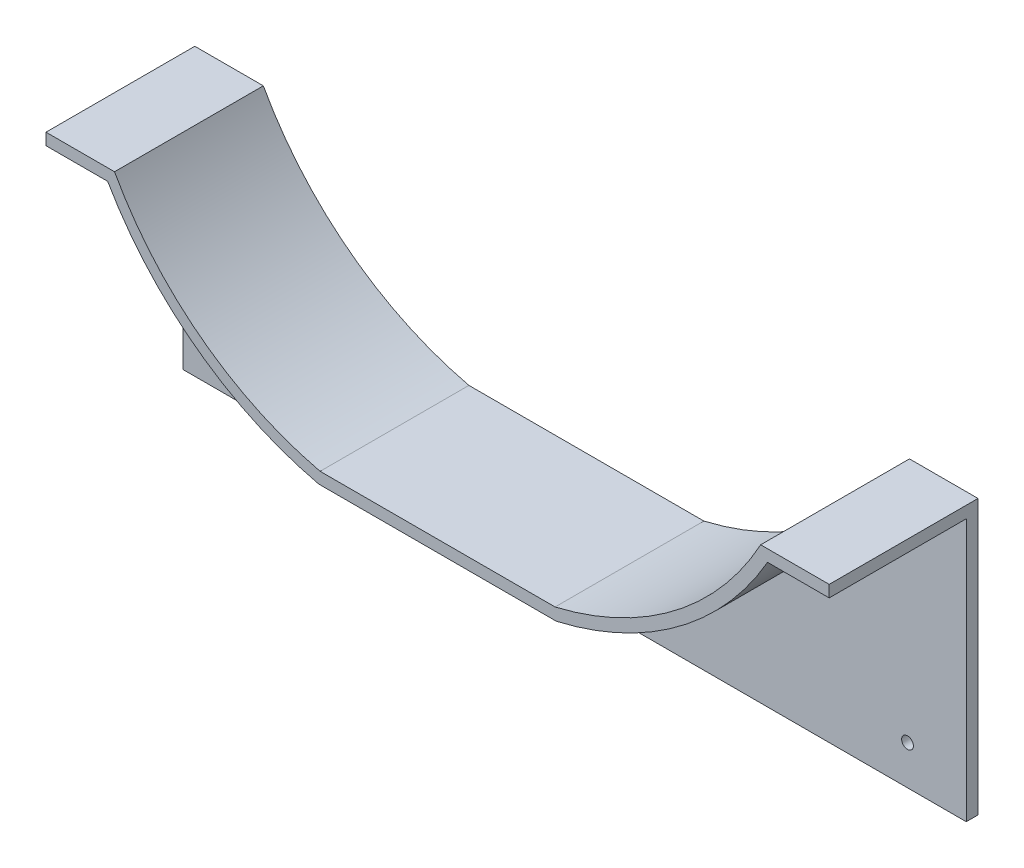
ISO-10303-21;
HEADER;
FILE_DESCRIPTION(('STEP AP214'),'2;1');
FILE_NAME('part.step','',(''),(''),'','','');
FILE_SCHEMA(('AUTOMOTIVE_DESIGN { 1 0 10303 214 1 1 1 1 }'));
ENDSEC;
DATA;
#1=APPLICATION_CONTEXT('core data for automotive mechanical design processes');
#2=APPLICATION_PROTOCOL_DEFINITION('international standard','automotive_design',2000,#1);
#3=PRODUCT_CONTEXT('',#1,'mechanical');
#4=PRODUCT('Part','Part','',(#3));
#5=PRODUCT_RELATED_PRODUCT_CATEGORY('part','',(#4));
#6=PRODUCT_DEFINITION_FORMATION('','',#4);
#7=PRODUCT_DEFINITION_CONTEXT('part definition',#1,'design');
#8=PRODUCT_DEFINITION('design','',#6,#7);
#9=PRODUCT_DEFINITION_SHAPE('','',#8);
#10=(LENGTH_UNIT() NAMED_UNIT(*) SI_UNIT(.MILLI.,.METRE.));
#11=(NAMED_UNIT(*) PLANE_ANGLE_UNIT() SI_UNIT($,.RADIAN.));
#12=(NAMED_UNIT(*) SI_UNIT($,.STERADIAN.) SOLID_ANGLE_UNIT());
#13=UNCERTAINTY_MEASURE_WITH_UNIT(LENGTH_MEASURE(1.E-05),#10,'distance_accuracy_value','');
#14=(GEOMETRIC_REPRESENTATION_CONTEXT(3) GLOBAL_UNCERTAINTY_ASSIGNED_CONTEXT((#13)) GLOBAL_UNIT_ASSIGNED_CONTEXT((#10,
#11,#12)) REPRESENTATION_CONTEXT('',''));
#15=CARTESIAN_POINT('',(0.,0.,0.));
#16=DIRECTION('',(0.,0.,1.));
#17=DIRECTION('',(1.,0.,0.));
#18=AXIS2_PLACEMENT_3D('',#15,#16,#17);
#19=CARTESIAN_POINT('',(0.,0.,3.));
#20=DIRECTION('',(0.,0.,1.));
#21=DIRECTION('',(1.,0.,0.));
#22=AXIS2_PLACEMENT_3D('',#19,#20,#21);
#23=PLANE('',#22);
#24=CARTESIAN_POINT('',(185.,-20.,3.));
#25=DIRECTION('',(0.,0.,1.));
#26=DIRECTION('',(1.,0.,0.));
#27=AXIS2_PLACEMENT_3D('',#24,#25,#26);
#28=CIRCLE('',#27,1.5);
#29=CARTESIAN_POINT('',(186.5,-20.,3.));
#30=VERTEX_POINT('',#29);
#31=EDGE_CURVE('E235',#30,#30,#28,.T.);
#32=ORIENTED_EDGE('',*,*,#31,.F.);
#33=EDGE_LOOP('',(#32));
#34=FACE_BOUND('',#33,.T.);
#35=CARTESIAN_POINT('',(100.,-20.,3.));
#36=DIRECTION('',(0.,0.,1.));
#37=DIRECTION('',(1.,0.,0.));
#38=AXIS2_PLACEMENT_3D('',#35,#36,#37);
#39=CIRCLE('',#38,1.5);
#40=CARTESIAN_POINT('',(101.5,-20.,3.));
#41=VERTEX_POINT('',#40);
#42=EDGE_CURVE('E240',#41,#41,#39,.T.);
#43=ORIENTED_EDGE('',*,*,#42,.F.);
#44=EDGE_LOOP('',(#43));
#45=FACE_BOUND('',#44,.T.);
#46=CARTESIAN_POINT('',(15.,-20.,3.));
#47=DIRECTION('',(0.,0.,1.));
#48=DIRECTION('',(-1.,0.,0.));
#49=AXIS2_PLACEMENT_3D('',#46,#47,#48);
#50=CIRCLE('',#49,1.5);
#51=CARTESIAN_POINT('',(16.5,-20.,3.));
#52=VERTEX_POINT('',#51);
#53=EDGE_CURVE('E249',#52,#52,#50,.T.);
#54=ORIENTED_EDGE('',*,*,#53,.F.);
#55=EDGE_LOOP('',(#54));
#56=FACE_BOUND('',#55,.T.);
#57=CARTESIAN_POINT('',(88.6536438802726,78.9360325928578,3.));
#58=DIRECTION('',(0.,0.,1.));
#59=DIRECTION('',(1.,0.,0.));
#60=AXIS2_PLACEMENT_3D('',#57,#58,#59);
#61=CIRCLE('',#60,84.110145305706);
#62=CARTESIAN_POINT('',(15.7435230895501,37.,3.));
#63=VERTEX_POINT('',#62);
#64=CARTESIAN_POINT('',(69.6535621359979,-3.,3.));
#65=VERTEX_POINT('',#64);
#66=EDGE_CURVE('E212',#63,#65,#61,.T.);
#67=ORIENTED_EDGE('',*,*,#66,.F.);
#68=DIRECTION('',(-1.,0.,0.));
#69=VECTOR('',#68,1.);
#70=CARTESIAN_POINT('',(0.,37.,3.));
#71=LINE('',#70,#69);
#72=CARTESIAN_POINT('',(0.,37.,3.));
#73=VERTEX_POINT('',#72);
#74=EDGE_CURVE('E149',#63,#73,#71,.T.);
#75=ORIENTED_EDGE('',*,*,#74,.T.);
#76=DIRECTION('',(0.,-1.,0.));
#77=VECTOR('',#76,1.);
#78=CARTESIAN_POINT('',(0.,0.,3.));
#79=LINE('',#78,#77);
#80=CARTESIAN_POINT('',(0.,-30.,3.));
#81=VERTEX_POINT('',#80);
#82=EDGE_CURVE('E262',#73,#81,#79,.T.);
#83=ORIENTED_EDGE('',*,*,#82,.T.);
#84=DIRECTION('',(1.,0.,0.));
#85=VECTOR('',#84,1.);
#86=CARTESIAN_POINT('',(0.,-30.,3.));
#87=LINE('',#86,#85);
#88=CARTESIAN_POINT('',(200.,-30.,3.));
#89=VERTEX_POINT('',#88);
#90=EDGE_CURVE('E266',#81,#89,#87,.T.);
#91=ORIENTED_EDGE('',*,*,#90,.T.);
#92=DIRECTION('',(0.,-1.,0.));
#93=VECTOR('',#92,1.);
#94=CARTESIAN_POINT('',(200.,0.,3.));
#95=LINE('',#94,#93);
#96=CARTESIAN_POINT('',(200.,37.,3.));
#97=VERTEX_POINT('',#96);
#98=EDGE_CURVE('E259',#97,#89,#95,.T.);
#99=ORIENTED_EDGE('',*,*,#98,.F.);
#100=DIRECTION('',(1.,0.,0.));
#101=VECTOR('',#100,1.);
#102=CARTESIAN_POINT('',(0.,37.,3.));
#103=LINE('',#102,#101);
#104=CARTESIAN_POINT('',(184.25647691045,37.,3.));
#105=VERTEX_POINT('',#104);
#106=EDGE_CURVE('E59',#105,#97,#103,.T.);
#107=ORIENTED_EDGE('',*,*,#106,.F.);
#108=CARTESIAN_POINT('',(111.346356119727,78.9360325928578,3.));
#109=DIRECTION('',(0.,0.,1.));
#110=DIRECTION('',(1.,0.,0.));
#111=AXIS2_PLACEMENT_3D('',#108,#109,#110);
#112=CIRCLE('',#111,84.110145305706);
#113=CARTESIAN_POINT('',(130.346437864002,-3.,3.));
#114=VERTEX_POINT('',#113);
#115=EDGE_CURVE('E63',#114,#105,#112,.T.);
#116=ORIENTED_EDGE('',*,*,#115,.F.);
#117=DIRECTION('',(-1.,0.,0.));
#118=VECTOR('',#117,1.);
#119=CARTESIAN_POINT('',(0.,-3.,3.));
#120=LINE('',#119,#118);
#121=EDGE_CURVE('E215',#114,#65,#120,.T.);
#122=ORIENTED_EDGE('',*,*,#121,.T.);
#123=EDGE_LOOP('',(#67,#75,#83,#91,#99,#107,#116,#122));
#124=FACE_BOUND('',#123,.T.);
#125=ADVANCED_FACE('F43',(#34,#45,#56,#124),#23,.T.);
#126=CARTESIAN_POINT('',(200.,0.,3.));
#127=DIRECTION('',(1.,0.,0.));
#128=DIRECTION('',(0.,0.,-1.));
#129=AXIS2_PLACEMENT_3D('',#126,#127,#128);
#130=PLANE('',#129);
#131=DIRECTION('',(0.,-1.,0.));
#132=VECTOR('',#131,1.);
#133=CARTESIAN_POINT('',(200.,0.,0.));
#134=LINE('',#133,#132);
#135=CARTESIAN_POINT('',(200.,40.,0.));
#136=VERTEX_POINT('',#135);
#137=CARTESIAN_POINT('',(200.,-30.,0.));
#138=VERTEX_POINT('',#137);
#139=EDGE_CURVE('E244',#136,#138,#134,.T.);
#140=ORIENTED_EDGE('',*,*,#139,.F.);
#141=DIRECTION('',(0.,0.,-1.));
#142=VECTOR('',#141,1.);
#143=CARTESIAN_POINT('',(200.,40.,3.));
#144=LINE('',#143,#142);
#145=CARTESIAN_POINT('',(200.,40.,38.));
#146=VERTEX_POINT('',#145);
#147=EDGE_CURVE('E11',#146,#136,#144,.T.);
#148=ORIENTED_EDGE('',*,*,#147,.F.);
#149=DIRECTION('',(0.,1.,0.));
#150=VECTOR('',#149,1.);
#151=CARTESIAN_POINT('',(200.,0.,38.));
#152=LINE('',#151,#150);
#153=CARTESIAN_POINT('',(200.,37.,38.));
#154=VERTEX_POINT('',#153);
#155=EDGE_CURVE('E184',#154,#146,#152,.T.);
#156=ORIENTED_EDGE('',*,*,#155,.F.);
#157=DIRECTION('',(0.,0.,-1.));
#158=VECTOR('',#157,1.);
#159=CARTESIAN_POINT('',(200.,37.,38.));
#160=LINE('',#159,#158);
#161=EDGE_CURVE('E222',#154,#97,#160,.T.);
#162=ORIENTED_EDGE('',*,*,#161,.T.);
#163=ORIENTED_EDGE('',*,*,#98,.T.);
#164=DIRECTION('',(0.,0.,-1.));
#165=VECTOR('',#164,1.);
#166=CARTESIAN_POINT('',(200.,-30.,3.));
#167=LINE('',#166,#165);
#168=EDGE_CURVE('E270',#89,#138,#167,.T.);
#169=ORIENTED_EDGE('',*,*,#168,.T.);
#170=EDGE_LOOP('',(#140,#148,#156,#162,#163,#169));
#171=FACE_BOUND('',#170,.T.);
#172=ADVANCED_FACE('F45',(#171),#130,.T.);
#173=CARTESIAN_POINT('',(0.,39.9999999999999,3.));
#174=DIRECTION('',(0.,-1.,0.));
#175=DIRECTION('',(1.,0.,0.));
#176=AXIS2_PLACEMENT_3D('',#173,#174,#175);
#177=PLANE('',#176);
#178=DIRECTION('',(-1.,0.,0.));
#179=VECTOR('',#178,1.);
#180=CARTESIAN_POINT('',(0.,39.9999999999999,0.));
#181=LINE('',#180,#179);
#182=CARTESIAN_POINT('',(182.5,40.,0.));
#183=VERTEX_POINT('',#182);
#184=EDGE_CURVE('E274',#136,#183,#181,.T.);
#185=ORIENTED_EDGE('',*,*,#184,.T.);
#186=DIRECTION('',(0.,0.,-1.));
#187=VECTOR('',#186,1.);
#188=CARTESIAN_POINT('',(182.5,40.,3.));
#189=LINE('',#188,#187);
#190=CARTESIAN_POINT('',(182.5,40.,38.));
#191=VERTEX_POINT('',#190);
#192=EDGE_CURVE('E52',#191,#183,#189,.T.);
#193=ORIENTED_EDGE('',*,*,#192,.F.);
#194=DIRECTION('',(-1.,0.,0.));
#195=VECTOR('',#194,1.);
#196=CARTESIAN_POINT('',(0.,39.9999999999999,38.));
#197=LINE('',#196,#195);
#198=EDGE_CURVE('E188',#146,#191,#197,.T.);
#199=ORIENTED_EDGE('',*,*,#198,.F.);
#200=ORIENTED_EDGE('',*,*,#147,.T.);
#201=EDGE_LOOP('',(#185,#193,#199,#200));
#202=FACE_BOUND('',#201,.T.);
#203=ADVANCED_FACE('F335',(#202),#177,.F.);
#204=CARTESIAN_POINT('',(111.346356119727,78.9360325928578,3.));
#205=DIRECTION('',(0.,0.,-1.));
#206=DIRECTION('',(-1.,0.,0.));
#207=AXIS2_PLACEMENT_3D('',#204,#205,#206);
#208=CYLINDRICAL_SURFACE('',#207,81.110145305706);
#209=CARTESIAN_POINT('',(111.346356119727,78.9360325928578,0.));
#210=DIRECTION('',(0.,0.,1.));
#211=DIRECTION('',(1.,0.,0.));
#212=AXIS2_PLACEMENT_3D('',#209,#210,#211);
#213=CIRCLE('',#212,81.110145305706);
#214=CARTESIAN_POINT('',(130.,0.,0.));
#215=VERTEX_POINT('',#214);
#216=EDGE_CURVE('E277',#183,#215,#213,.F.);
#217=ORIENTED_EDGE('',*,*,#216,.T.);
#218=DIRECTION('',(0.,0.,-1.));
#219=VECTOR('',#218,1.);
#220=CARTESIAN_POINT('',(130.,0.,3.));
#221=LINE('',#220,#219);
#222=CARTESIAN_POINT('',(130.,0.,38.));
#223=VERTEX_POINT('',#222);
#224=EDGE_CURVE('E314',#223,#215,#221,.T.);
#225=ORIENTED_EDGE('',*,*,#224,.F.);
#226=CARTESIAN_POINT('',(111.346356119727,78.9360325928578,38.));
#227=DIRECTION('',(0.,0.,1.));
#228=DIRECTION('',(1.,0.,0.));
#229=AXIS2_PLACEMENT_3D('',#226,#227,#228);
#230=CIRCLE('',#229,81.110145305706);
#231=EDGE_CURVE('E192',#191,#223,#230,.F.);
#232=ORIENTED_EDGE('',*,*,#231,.F.);
#233=ORIENTED_EDGE('',*,*,#192,.T.);
#234=EDGE_LOOP('',(#217,#225,#232,#233));
#235=FACE_BOUND('',#234,.T.);
#236=ADVANCED_FACE('F321',(#235),#208,.F.);
#237=CARTESIAN_POINT('',(0.,0.,3.));
#238=DIRECTION('',(0.,1.,0.));
#239=DIRECTION('',(0.,0.,1.));
#240=AXIS2_PLACEMENT_3D('',#237,#238,#239);
#241=PLANE('',#240);
#242=DIRECTION('',(1.,0.,0.));
#243=VECTOR('',#242,1.);
#244=CARTESIAN_POINT('',(0.,0.,0.));
#245=LINE('',#244,#243);
#246=CARTESIAN_POINT('',(70.,0.,0.));
#247=VERTEX_POINT('',#246);
#248=EDGE_CURVE('E281',#247,#215,#245,.T.);
#249=ORIENTED_EDGE('',*,*,#248,.F.);
#250=DIRECTION('',(0.,0.,-1.));
#251=VECTOR('',#250,1.);
#252=CARTESIAN_POINT('',(70.,0.,3.));
#253=LINE('',#252,#251);
#254=CARTESIAN_POINT('',(70.,0.,38.));
#255=VERTEX_POINT('',#254);
#256=EDGE_CURVE('E311',#255,#247,#253,.T.);
#257=ORIENTED_EDGE('',*,*,#256,.F.);
#258=DIRECTION('',(-1.,0.,0.));
#259=VECTOR('',#258,1.);
#260=CARTESIAN_POINT('',(0.,0.,38.));
#261=LINE('',#260,#259);
#262=EDGE_CURVE('E196',#223,#255,#261,.T.);
#263=ORIENTED_EDGE('',*,*,#262,.F.);
#264=ORIENTED_EDGE('',*,*,#224,.T.);
#265=EDGE_LOOP('',(#249,#257,#263,#264));
#266=FACE_BOUND('',#265,.T.);
#267=ADVANCED_FACE('F331',(#266),#241,.T.);
#268=CARTESIAN_POINT('',(88.6536438802726,78.9360325928578,3.));
#269=DIRECTION('',(0.,0.,-1.));
#270=DIRECTION('',(-1.,0.,0.));
#271=AXIS2_PLACEMENT_3D('',#268,#269,#270);
#272=CYLINDRICAL_SURFACE('',#271,81.110145305706);
#273=CARTESIAN_POINT('',(88.6536438802726,78.9360325928578,0.));
#274=DIRECTION('',(0.,0.,1.));
#275=DIRECTION('',(1.,0.,0.));
#276=AXIS2_PLACEMENT_3D('',#273,#274,#275);
#277=CIRCLE('',#276,81.110145305706);
#278=CARTESIAN_POINT('',(17.5,40.,0.));
#279=VERTEX_POINT('',#278);
#280=EDGE_CURVE('E285',#279,#247,#277,.T.);
#281=ORIENTED_EDGE('',*,*,#280,.F.);
#282=DIRECTION('',(0.,0.,-1.));
#283=VECTOR('',#282,1.);
#284=CARTESIAN_POINT('',(17.5,40.,3.));
#285=LINE('',#284,#283);
#286=CARTESIAN_POINT('',(17.5,40.,38.));
#287=VERTEX_POINT('',#286);
#288=EDGE_CURVE('E308',#287,#279,#285,.T.);
#289=ORIENTED_EDGE('',*,*,#288,.F.);
#290=CARTESIAN_POINT('',(88.6536438802726,78.9360325928578,38.));
#291=DIRECTION('',(0.,0.,1.));
#292=DIRECTION('',(1.,0.,0.));
#293=AXIS2_PLACEMENT_3D('',#290,#291,#292);
#294=CIRCLE('',#293,81.110145305706);
#295=EDGE_CURVE('E200',#255,#287,#294,.F.);
#296=ORIENTED_EDGE('',*,*,#295,.F.);
#297=ORIENTED_EDGE('',*,*,#256,.T.);
#298=EDGE_LOOP('',(#281,#289,#296,#297));
#299=FACE_BOUND('',#298,.T.);
#300=ADVANCED_FACE('F352',(#299),#272,.F.);
#301=CARTESIAN_POINT('',(0.,40.,3.));
#302=DIRECTION('',(0.,1.,0.));
#303=DIRECTION('',(-1.,0.,0.));
#304=AXIS2_PLACEMENT_3D('',#301,#302,#303);
#305=PLANE('',#304);
#306=DIRECTION('',(1.,0.,0.));
#307=VECTOR('',#306,1.);
#308=CARTESIAN_POINT('',(0.,40.,0.));
#309=LINE('',#308,#307);
#310=CARTESIAN_POINT('',(0.,40.,0.));
#311=VERTEX_POINT('',#310);
#312=EDGE_CURVE('E289',#311,#279,#309,.T.);
#313=ORIENTED_EDGE('',*,*,#312,.F.);
#314=DIRECTION('',(0.,0.,-1.));
#315=VECTOR('',#314,1.);
#316=CARTESIAN_POINT('',(0.,40.,3.));
#317=LINE('',#316,#315);
#318=CARTESIAN_POINT('',(0.,40.,38.));
#319=VERTEX_POINT('',#318);
#320=EDGE_CURVE('E305',#319,#311,#317,.T.);
#321=ORIENTED_EDGE('',*,*,#320,.F.);
#322=DIRECTION('',(-1.,0.,0.));
#323=VECTOR('',#322,1.);
#324=CARTESIAN_POINT('',(0.,40.,38.));
#325=LINE('',#324,#323);
#326=EDGE_CURVE('E204',#287,#319,#325,.T.);
#327=ORIENTED_EDGE('',*,*,#326,.F.);
#328=ORIENTED_EDGE('',*,*,#288,.T.);
#329=EDGE_LOOP('',(#313,#321,#327,#328));
#330=FACE_BOUND('',#329,.T.);
#331=ADVANCED_FACE('F350',(#330),#305,.T.);
#332=CARTESIAN_POINT('',(0.,0.,3.));
#333=DIRECTION('',(1.,0.,0.));
#334=DIRECTION('',(0.,1.,0.));
#335=AXIS2_PLACEMENT_3D('',#332,#333,#334);
#336=PLANE('',#335);
#337=DIRECTION('',(0.,-1.,0.));
#338=VECTOR('',#337,1.);
#339=CARTESIAN_POINT('',(0.,0.,0.));
#340=LINE('',#339,#338);
#341=CARTESIAN_POINT('',(0.,-30.,0.));
#342=VERTEX_POINT('',#341);
#343=EDGE_CURVE('E293',#311,#342,#340,.T.);
#344=ORIENTED_EDGE('',*,*,#343,.T.);
#345=DIRECTION('',(0.,0.,-1.));
#346=VECTOR('',#345,1.);
#347=CARTESIAN_POINT('',(0.,-30.,3.));
#348=LINE('',#347,#346);
#349=EDGE_CURVE('E301',#81,#342,#348,.T.);
#350=ORIENTED_EDGE('',*,*,#349,.F.);
#351=ORIENTED_EDGE('',*,*,#82,.F.);
#352=DIRECTION('',(0.,0.,-1.));
#353=VECTOR('',#352,1.);
#354=CARTESIAN_POINT('',(0.,37.,38.));
#355=LINE('',#354,#353);
#356=CARTESIAN_POINT('',(0.,37.,38.));
#357=VERTEX_POINT('',#356);
#358=EDGE_CURVE('E209',#357,#73,#355,.T.);
#359=ORIENTED_EDGE('',*,*,#358,.F.);
#360=DIRECTION('',(0.,-1.,0.));
#361=VECTOR('',#360,1.);
#362=CARTESIAN_POINT('',(0.,0.,38.));
#363=LINE('',#362,#361);
#364=EDGE_CURVE('E169',#319,#357,#363,.T.);
#365=ORIENTED_EDGE('',*,*,#364,.F.);
#366=ORIENTED_EDGE('',*,*,#320,.T.);
#367=EDGE_LOOP('',(#344,#350,#351,#359,#365,#366));
#368=FACE_BOUND('',#367,.T.);
#369=ADVANCED_FACE('F347',(#368),#336,.F.);
#370=CARTESIAN_POINT('',(0.,-30.,3.));
#371=DIRECTION('',(0.,1.,0.));
#372=DIRECTION('',(0.,0.,1.));
#373=AXIS2_PLACEMENT_3D('',#370,#371,#372);
#374=PLANE('',#373);
#375=DIRECTION('',(1.,0.,0.));
#376=VECTOR('',#375,1.);
#377=CARTESIAN_POINT('',(0.,-30.,0.));
#378=LINE('',#377,#376);
#379=EDGE_CURVE('E263',#342,#138,#378,.T.);
#380=ORIENTED_EDGE('',*,*,#379,.T.);
#381=ORIENTED_EDGE('',*,*,#168,.F.);
#382=ORIENTED_EDGE('',*,*,#90,.F.);
#383=ORIENTED_EDGE('',*,*,#349,.T.);
#384=EDGE_LOOP('',(#380,#381,#382,#383));
#385=FACE_BOUND('',#384,.T.);
#386=ADVANCED_FACE('F342',(#385),#374,.F.);
#387=CARTESIAN_POINT('',(0.,0.,0.));
#388=DIRECTION('',(0.,0.,1.));
#389=DIRECTION('',(1.,0.,0.));
#390=AXIS2_PLACEMENT_3D('',#387,#388,#389);
#391=PLANE('',#390);
#392=CARTESIAN_POINT('',(185.,-20.,0.));
#393=DIRECTION('',(0.,0.,1.));
#394=DIRECTION('',(1.,0.,0.));
#395=AXIS2_PLACEMENT_3D('',#392,#393,#394);
#396=CIRCLE('',#395,1.5);
#397=CARTESIAN_POINT('',(186.5,-20.,0.));
#398=VERTEX_POINT('',#397);
#399=EDGE_CURVE('E239',#398,#398,#396,.F.);
#400=ORIENTED_EDGE('',*,*,#399,.F.);
#401=EDGE_LOOP('',(#400));
#402=FACE_BOUND('',#401,.T.);
#403=CARTESIAN_POINT('',(100.,-20.,0.));
#404=DIRECTION('',(0.,0.,1.));
#405=DIRECTION('',(1.,0.,0.));
#406=AXIS2_PLACEMENT_3D('',#403,#404,#405);
#407=CIRCLE('',#406,1.5);
#408=CARTESIAN_POINT('',(101.5,-20.,0.));
#409=VERTEX_POINT('',#408);
#410=EDGE_CURVE('E245',#409,#409,#407,.F.);
#411=ORIENTED_EDGE('',*,*,#410,.F.);
#412=EDGE_LOOP('',(#411));
#413=FACE_BOUND('',#412,.T.);
#414=CARTESIAN_POINT('',(15.,-20.,0.));
#415=DIRECTION('',(0.,0.,1.));
#416=DIRECTION('',(1.,0.,0.));
#417=AXIS2_PLACEMENT_3D('',#414,#415,#416);
#418=CIRCLE('',#417,1.5);
#419=CARTESIAN_POINT('',(16.5,-20.,0.));
#420=VERTEX_POINT('',#419);
#421=EDGE_CURVE('E153',#420,#420,#418,.F.);
#422=ORIENTED_EDGE('',*,*,#421,.F.);
#423=EDGE_LOOP('',(#422));
#424=FACE_BOUND('',#423,.T.);
#425=ORIENTED_EDGE('',*,*,#139,.T.);
#426=ORIENTED_EDGE('',*,*,#379,.F.);
#427=ORIENTED_EDGE('',*,*,#343,.F.);
#428=ORIENTED_EDGE('',*,*,#312,.T.);
#429=ORIENTED_EDGE('',*,*,#280,.T.);
#430=ORIENTED_EDGE('',*,*,#248,.T.);
#431=ORIENTED_EDGE('',*,*,#216,.F.);
#432=ORIENTED_EDGE('',*,*,#184,.F.);
#433=EDGE_LOOP('',(#425,#426,#427,#428,#429,#430,#431,#432));
#434=FACE_BOUND('',#433,.T.);
#435=ADVANCED_FACE('F326',(#402,#413,#424,#434),#391,.F.);
#436=CARTESIAN_POINT('',(15.,-20.,-4.24264068711928));
#437=DIRECTION('',(0.,0.,1.));
#438=DIRECTION('',(1.,0.,0.));
#439=AXIS2_PLACEMENT_3D('',#436,#437,#438);
#440=CYLINDRICAL_SURFACE('',#439,1.5);
#441=CARTESIAN_POINT('',(16.5,-20.,0.));
#442=CARTESIAN_POINT('',(16.5,-20.,0.0312499999999992));
#443=CARTESIAN_POINT('',(16.5,-20.,0.0624999999999992));
#444=CARTESIAN_POINT('',(16.5,-20.,0.124999999999999));
#445=CARTESIAN_POINT('',(16.5,-20.,0.156249999999999));
#446=CARTESIAN_POINT('',(16.5,-20.,0.218749999999999));
#447=CARTESIAN_POINT('',(16.5,-20.,0.249999999999999));
#448=CARTESIAN_POINT('',(16.5,-20.,0.312499999999999));
#449=CARTESIAN_POINT('',(16.5,-20.,0.343749999999999));
#450=CARTESIAN_POINT('',(16.5,-20.,0.40625));
#451=CARTESIAN_POINT('',(16.5,-20.,0.4375));
#452=CARTESIAN_POINT('',(16.5,-20.,0.5));
#453=CARTESIAN_POINT('',(16.5,-20.,0.53125));
#454=CARTESIAN_POINT('',(16.5,-20.,0.59375));
#455=CARTESIAN_POINT('',(16.5,-20.,0.625));
#456=CARTESIAN_POINT('',(16.5,-20.,0.6875));
#457=CARTESIAN_POINT('',(16.5,-20.,0.71875));
#458=CARTESIAN_POINT('',(16.5,-20.,0.78125));
#459=CARTESIAN_POINT('',(16.5,-20.,0.8125));
#460=CARTESIAN_POINT('',(16.5,-20.,0.875));
#461=CARTESIAN_POINT('',(16.5,-20.,0.906249999999999));
#462=CARTESIAN_POINT('',(16.5,-20.,0.968749999999999));
#463=CARTESIAN_POINT('',(16.5,-20.,0.999999999999999));
#464=CARTESIAN_POINT('',(16.5,-20.,1.0625));
#465=CARTESIAN_POINT('',(16.5,-20.,1.09375));
#466=CARTESIAN_POINT('',(16.5,-20.,1.15625));
#467=CARTESIAN_POINT('',(16.5,-20.,1.1875));
#468=CARTESIAN_POINT('',(16.5,-20.,1.25));
#469=CARTESIAN_POINT('',(16.5,-20.,1.28125));
#470=CARTESIAN_POINT('',(16.5,-20.,1.34375));
#471=CARTESIAN_POINT('',(16.5,-20.,1.375));
#472=CARTESIAN_POINT('',(16.5,-20.,1.4375));
#473=CARTESIAN_POINT('',(16.5,-20.,1.46875));
#474=CARTESIAN_POINT('',(16.5,-20.,1.53125));
#475=CARTESIAN_POINT('',(16.5,-20.,1.5625));
#476=CARTESIAN_POINT('',(16.5,-20.,1.625));
#477=CARTESIAN_POINT('',(16.5,-20.,1.65625));
#478=CARTESIAN_POINT('',(16.5,-20.,1.71875));
#479=CARTESIAN_POINT('',(16.5,-20.,1.75));
#480=CARTESIAN_POINT('',(16.5,-20.,1.8125));
#481=CARTESIAN_POINT('',(16.5,-20.,1.84375));
#482=CARTESIAN_POINT('',(16.5,-20.,1.90625));
#483=CARTESIAN_POINT('',(16.5,-20.,1.9375));
#484=CARTESIAN_POINT('',(16.5,-20.,2.));
#485=CARTESIAN_POINT('',(16.5,-20.,2.03125));
#486=CARTESIAN_POINT('',(16.5,-20.,2.09375));
#487=CARTESIAN_POINT('',(16.5,-20.,2.125));
#488=CARTESIAN_POINT('',(16.5,-20.,2.1875));
#489=CARTESIAN_POINT('',(16.5,-20.,2.21875));
#490=CARTESIAN_POINT('',(16.5,-20.,2.28125));
#491=CARTESIAN_POINT('',(16.5,-20.,2.3125));
#492=CARTESIAN_POINT('',(16.5,-20.,2.375));
#493=CARTESIAN_POINT('',(16.5,-20.,2.40625));
#494=CARTESIAN_POINT('',(16.5,-20.,2.46875));
#495=CARTESIAN_POINT('',(16.5,-20.,2.5));
#496=CARTESIAN_POINT('',(16.5,-20.,2.5625));
#497=CARTESIAN_POINT('',(16.5,-20.,2.59375));
#498=CARTESIAN_POINT('',(16.5,-20.,2.65625));
#499=CARTESIAN_POINT('',(16.5,-20.,2.6875));
#500=CARTESIAN_POINT('',(16.5,-20.,2.75));
#501=CARTESIAN_POINT('',(16.5,-20.,2.78125));
#502=CARTESIAN_POINT('',(16.5,-20.,2.84375));
#503=CARTESIAN_POINT('',(16.5,-20.,2.875));
#504=CARTESIAN_POINT('',(16.5,-20.,2.9375));
#505=CARTESIAN_POINT('',(16.5,-20.,2.96875));
#506=CARTESIAN_POINT('',(16.5,-20.,3.));
#507=B_SPLINE_CURVE_WITH_KNOTS('',3,(#441,#442,#443,#444,#445,#446,#447,#448,#449,#450,#451,
#452,#453,#454,#455,#456,#457,#458,#459,#460,#461,#462,#463,#464,#465,#466,#467,#468,#469,#470,
#471,#472,#473,#474,#475,#476,#477,#478,#479,#480,#481,#482,#483,#484,#485,#486,#487,#488,#489,
#490,#491,#492,#493,#494,#495,#496,#497,#498,#499,#500,#501,#502,#503,#504,#505,#506),
.UNSPECIFIED.,.F.,.F.,(4,2,2,2,2,2,2,2,2,2,2,2,2,2,2,2,2,2,2,2,2,2,2,2,2,2,2,2,2,2,2,2,4),(0.,
0.0937500000000001,0.1875,0.28125,0.375,0.46875,0.5625,0.656250000000001,0.750000000000001,
0.843750000000001,0.9375,1.03125,1.125,1.21875,1.3125,1.40625,1.5,1.59375,1.6875,1.78125,1.875,
1.96875,2.0625,2.15625,2.25,2.34375,2.4375,2.53125,2.625,2.71875,2.8125,2.90625,3.),.UNSPECIFIED.);
#508=EDGE_CURVE('BSEAM371',#420,#52,#507,.T.);
#509=ORIENTED_EDGE('',*,*,#421,.T.);
#510=ORIENTED_EDGE('',*,*,#53,.T.);
#511=ORIENTED_EDGE('',*,*,#508,.T.);
#512=ORIENTED_EDGE('',*,*,#508,.F.);
#513=EDGE_LOOP('',(#509,#511,#510,#512));
#514=FACE_BOUND('',#513,.T.);
#515=ADVANCED_FACE('F371',(#514),#440,.F.);
#516=CARTESIAN_POINT('',(100.,-20.,-4.24264068711928));
#517=DIRECTION('',(0.,0.,1.));
#518=DIRECTION('',(1.,0.,0.));
#519=AXIS2_PLACEMENT_3D('',#516,#517,#518);
#520=CYLINDRICAL_SURFACE('',#519,1.5);
#521=CARTESIAN_POINT('',(101.5,-20.,0.));
#522=CARTESIAN_POINT('',(101.5,-20.,0.0312499999999992));
#523=CARTESIAN_POINT('',(101.5,-20.,0.0624999999999992));
#524=CARTESIAN_POINT('',(101.5,-20.,0.124999999999999));
#525=CARTESIAN_POINT('',(101.5,-20.,0.156249999999999));
#526=CARTESIAN_POINT('',(101.5,-20.,0.218749999999999));
#527=CARTESIAN_POINT('',(101.5,-20.,0.249999999999999));
#528=CARTESIAN_POINT('',(101.5,-20.,0.312499999999999));
#529=CARTESIAN_POINT('',(101.5,-20.,0.343749999999999));
#530=CARTESIAN_POINT('',(101.5,-20.,0.40625));
#531=CARTESIAN_POINT('',(101.5,-20.,0.4375));
#532=CARTESIAN_POINT('',(101.5,-20.,0.5));
#533=CARTESIAN_POINT('',(101.5,-20.,0.53125));
#534=CARTESIAN_POINT('',(101.5,-20.,0.59375));
#535=CARTESIAN_POINT('',(101.5,-20.,0.625));
#536=CARTESIAN_POINT('',(101.5,-20.,0.6875));
#537=CARTESIAN_POINT('',(101.5,-20.,0.71875));
#538=CARTESIAN_POINT('',(101.5,-20.,0.78125));
#539=CARTESIAN_POINT('',(101.5,-20.,0.8125));
#540=CARTESIAN_POINT('',(101.5,-20.,0.875));
#541=CARTESIAN_POINT('',(101.5,-20.,0.906249999999999));
#542=CARTESIAN_POINT('',(101.5,-20.,0.968749999999999));
#543=CARTESIAN_POINT('',(101.5,-20.,0.999999999999999));
#544=CARTESIAN_POINT('',(101.5,-20.,1.0625));
#545=CARTESIAN_POINT('',(101.5,-20.,1.09375));
#546=CARTESIAN_POINT('',(101.5,-20.,1.15625));
#547=CARTESIAN_POINT('',(101.5,-20.,1.1875));
#548=CARTESIAN_POINT('',(101.5,-20.,1.25));
#549=CARTESIAN_POINT('',(101.5,-20.,1.28125));
#550=CARTESIAN_POINT('',(101.5,-20.,1.34375));
#551=CARTESIAN_POINT('',(101.5,-20.,1.375));
#552=CARTESIAN_POINT('',(101.5,-20.,1.4375));
#553=CARTESIAN_POINT('',(101.5,-20.,1.46875));
#554=CARTESIAN_POINT('',(101.5,-20.,1.53125));
#555=CARTESIAN_POINT('',(101.5,-20.,1.5625));
#556=CARTESIAN_POINT('',(101.5,-20.,1.625));
#557=CARTESIAN_POINT('',(101.5,-20.,1.65625));
#558=CARTESIAN_POINT('',(101.5,-20.,1.71875));
#559=CARTESIAN_POINT('',(101.5,-20.,1.75));
#560=CARTESIAN_POINT('',(101.5,-20.,1.8125));
#561=CARTESIAN_POINT('',(101.5,-20.,1.84375));
#562=CARTESIAN_POINT('',(101.5,-20.,1.90625));
#563=CARTESIAN_POINT('',(101.5,-20.,1.9375));
#564=CARTESIAN_POINT('',(101.5,-20.,2.));
#565=CARTESIAN_POINT('',(101.5,-20.,2.03125));
#566=CARTESIAN_POINT('',(101.5,-20.,2.09375));
#567=CARTESIAN_POINT('',(101.5,-20.,2.125));
#568=CARTESIAN_POINT('',(101.5,-20.,2.1875));
#569=CARTESIAN_POINT('',(101.5,-20.,2.21875));
#570=CARTESIAN_POINT('',(101.5,-20.,2.28125));
#571=CARTESIAN_POINT('',(101.5,-20.,2.3125));
#572=CARTESIAN_POINT('',(101.5,-20.,2.375));
#573=CARTESIAN_POINT('',(101.5,-20.,2.40625));
#574=CARTESIAN_POINT('',(101.5,-20.,2.46875));
#575=CARTESIAN_POINT('',(101.5,-20.,2.5));
#576=CARTESIAN_POINT('',(101.5,-20.,2.5625));
#577=CARTESIAN_POINT('',(101.5,-20.,2.59375));
#578=CARTESIAN_POINT('',(101.5,-20.,2.65625));
#579=CARTESIAN_POINT('',(101.5,-20.,2.6875));
#580=CARTESIAN_POINT('',(101.5,-20.,2.75));
#581=CARTESIAN_POINT('',(101.5,-20.,2.78125));
#582=CARTESIAN_POINT('',(101.5,-20.,2.84375));
#583=CARTESIAN_POINT('',(101.5,-20.,2.875));
#584=CARTESIAN_POINT('',(101.5,-20.,2.9375));
#585=CARTESIAN_POINT('',(101.5,-20.,2.96875));
#586=CARTESIAN_POINT('',(101.5,-20.,3.));
#587=B_SPLINE_CURVE_WITH_KNOTS('',3,(#521,#522,#523,#524,#525,#526,#527,#528,#529,#530,#531,
#532,#533,#534,#535,#536,#537,#538,#539,#540,#541,#542,#543,#544,#545,#546,#547,#548,#549,#550,
#551,#552,#553,#554,#555,#556,#557,#558,#559,#560,#561,#562,#563,#564,#565,#566,#567,#568,#569,
#570,#571,#572,#573,#574,#575,#576,#577,#578,#579,#580,#581,#582,#583,#584,#585,#586),
.UNSPECIFIED.,.F.,.F.,(4,2,2,2,2,2,2,2,2,2,2,2,2,2,2,2,2,2,2,2,2,2,2,2,2,2,2,2,2,2,2,2,4),(0.,
0.0937500000000001,0.1875,0.28125,0.375,0.46875,0.5625,0.656250000000001,0.750000000000001,
0.843750000000001,0.9375,1.03125,1.125,1.21875,1.3125,1.40625,1.5,1.59375,1.6875,1.78125,1.875,
1.96875,2.0625,2.15625,2.25,2.34375,2.4375,2.53125,2.625,2.71875,2.8125,2.90625,3.),.UNSPECIFIED.);
#588=EDGE_CURVE('BSEAM394',#409,#41,#587,.T.);
#589=ORIENTED_EDGE('',*,*,#410,.T.);
#590=ORIENTED_EDGE('',*,*,#42,.T.);
#591=ORIENTED_EDGE('',*,*,#588,.T.);
#592=ORIENTED_EDGE('',*,*,#588,.F.);
#593=EDGE_LOOP('',(#589,#591,#590,#592));
#594=FACE_BOUND('',#593,.T.);
#595=ADVANCED_FACE('F394',(#594),#520,.F.);
#596=CARTESIAN_POINT('',(185.,-20.,-4.24264068711928));
#597=DIRECTION('',(0.,0.,1.));
#598=DIRECTION('',(1.,0.,0.));
#599=AXIS2_PLACEMENT_3D('',#596,#597,#598);
#600=CYLINDRICAL_SURFACE('',#599,1.5);
#601=CARTESIAN_POINT('',(186.5,-20.,0.));
#602=CARTESIAN_POINT('',(186.5,-20.,0.0312499999999992));
#603=CARTESIAN_POINT('',(186.5,-20.,0.0624999999999992));
#604=CARTESIAN_POINT('',(186.5,-20.,0.124999999999999));
#605=CARTESIAN_POINT('',(186.5,-20.,0.156249999999999));
#606=CARTESIAN_POINT('',(186.5,-20.,0.218749999999999));
#607=CARTESIAN_POINT('',(186.5,-20.,0.249999999999999));
#608=CARTESIAN_POINT('',(186.5,-20.,0.312499999999999));
#609=CARTESIAN_POINT('',(186.5,-20.,0.343749999999999));
#610=CARTESIAN_POINT('',(186.5,-20.,0.40625));
#611=CARTESIAN_POINT('',(186.5,-20.,0.4375));
#612=CARTESIAN_POINT('',(186.5,-20.,0.5));
#613=CARTESIAN_POINT('',(186.5,-20.,0.53125));
#614=CARTESIAN_POINT('',(186.5,-20.,0.59375));
#615=CARTESIAN_POINT('',(186.5,-20.,0.625));
#616=CARTESIAN_POINT('',(186.5,-20.,0.6875));
#617=CARTESIAN_POINT('',(186.5,-20.,0.71875));
#618=CARTESIAN_POINT('',(186.5,-20.,0.78125));
#619=CARTESIAN_POINT('',(186.5,-20.,0.8125));
#620=CARTESIAN_POINT('',(186.5,-20.,0.875));
#621=CARTESIAN_POINT('',(186.5,-20.,0.906249999999999));
#622=CARTESIAN_POINT('',(186.5,-20.,0.968749999999999));
#623=CARTESIAN_POINT('',(186.5,-20.,0.999999999999999));
#624=CARTESIAN_POINT('',(186.5,-20.,1.0625));
#625=CARTESIAN_POINT('',(186.5,-20.,1.09375));
#626=CARTESIAN_POINT('',(186.5,-20.,1.15625));
#627=CARTESIAN_POINT('',(186.5,-20.,1.1875));
#628=CARTESIAN_POINT('',(186.5,-20.,1.25));
#629=CARTESIAN_POINT('',(186.5,-20.,1.28125));
#630=CARTESIAN_POINT('',(186.5,-20.,1.34375));
#631=CARTESIAN_POINT('',(186.5,-20.,1.375));
#632=CARTESIAN_POINT('',(186.5,-20.,1.4375));
#633=CARTESIAN_POINT('',(186.5,-20.,1.46875));
#634=CARTESIAN_POINT('',(186.5,-20.,1.53125));
#635=CARTESIAN_POINT('',(186.5,-20.,1.5625));
#636=CARTESIAN_POINT('',(186.5,-20.,1.625));
#637=CARTESIAN_POINT('',(186.5,-20.,1.65625));
#638=CARTESIAN_POINT('',(186.5,-20.,1.71875));
#639=CARTESIAN_POINT('',(186.5,-20.,1.75));
#640=CARTESIAN_POINT('',(186.5,-20.,1.8125));
#641=CARTESIAN_POINT('',(186.5,-20.,1.84375));
#642=CARTESIAN_POINT('',(186.5,-20.,1.90625));
#643=CARTESIAN_POINT('',(186.5,-20.,1.9375));
#644=CARTESIAN_POINT('',(186.5,-20.,2.));
#645=CARTESIAN_POINT('',(186.5,-20.,2.03125));
#646=CARTESIAN_POINT('',(186.5,-20.,2.09375));
#647=CARTESIAN_POINT('',(186.5,-20.,2.125));
#648=CARTESIAN_POINT('',(186.5,-20.,2.1875));
#649=CARTESIAN_POINT('',(186.5,-20.,2.21875));
#650=CARTESIAN_POINT('',(186.5,-20.,2.28125));
#651=CARTESIAN_POINT('',(186.5,-20.,2.3125));
#652=CARTESIAN_POINT('',(186.5,-20.,2.375));
#653=CARTESIAN_POINT('',(186.5,-20.,2.40625));
#654=CARTESIAN_POINT('',(186.5,-20.,2.46875));
#655=CARTESIAN_POINT('',(186.5,-20.,2.5));
#656=CARTESIAN_POINT('',(186.5,-20.,2.5625));
#657=CARTESIAN_POINT('',(186.5,-20.,2.59375));
#658=CARTESIAN_POINT('',(186.5,-20.,2.65625));
#659=CARTESIAN_POINT('',(186.5,-20.,2.6875));
#660=CARTESIAN_POINT('',(186.5,-20.,2.75));
#661=CARTESIAN_POINT('',(186.5,-20.,2.78125));
#662=CARTESIAN_POINT('',(186.5,-20.,2.84375));
#663=CARTESIAN_POINT('',(186.5,-20.,2.875));
#664=CARTESIAN_POINT('',(186.5,-20.,2.9375));
#665=CARTESIAN_POINT('',(186.5,-20.,2.96875));
#666=CARTESIAN_POINT('',(186.5,-20.,3.));
#667=B_SPLINE_CURVE_WITH_KNOTS('',3,(#601,#602,#603,#604,#605,#606,#607,#608,#609,#610,#611,
#612,#613,#614,#615,#616,#617,#618,#619,#620,#621,#622,#623,#624,#625,#626,#627,#628,#629,#630,
#631,#632,#633,#634,#635,#636,#637,#638,#639,#640,#641,#642,#643,#644,#645,#646,#647,#648,#649,
#650,#651,#652,#653,#654,#655,#656,#657,#658,#659,#660,#661,#662,#663,#664,#665,#666),
.UNSPECIFIED.,.F.,.F.,(4,2,2,2,2,2,2,2,2,2,2,2,2,2,2,2,2,2,2,2,2,2,2,2,2,2,2,2,2,2,2,2,4),(0.,
0.0937500000000001,0.1875,0.28125,0.375,0.46875,0.5625,0.656250000000001,0.750000000000001,
0.843750000000001,0.9375,1.03125,1.125,1.21875,1.3125,1.40625,1.5,1.59375,1.6875,1.78125,1.875,
1.96875,2.0625,2.15625,2.25,2.34375,2.4375,2.53125,2.625,2.71875,2.8125,2.90625,3.),.UNSPECIFIED.);
#668=EDGE_CURVE('BSEAM400',#398,#30,#667,.T.);
#669=ORIENTED_EDGE('',*,*,#399,.T.);
#670=ORIENTED_EDGE('',*,*,#31,.T.);
#671=ORIENTED_EDGE('',*,*,#668,.T.);
#672=ORIENTED_EDGE('',*,*,#668,.F.);
#673=EDGE_LOOP('',(#669,#671,#670,#672));
#674=FACE_BOUND('',#673,.T.);
#675=ADVANCED_FACE('F400',(#674),#600,.F.);
#676=CARTESIAN_POINT('',(0.,37.,38.));
#677=DIRECTION('',(0.,-1.,0.));
#678=DIRECTION('',(0.,0.,-1.));
#679=AXIS2_PLACEMENT_3D('',#676,#677,#678);
#680=PLANE('',#679);
#681=ORIENTED_EDGE('',*,*,#74,.F.);
#682=DIRECTION('',(0.,0.,-1.));
#683=VECTOR('',#682,1.);
#684=CARTESIAN_POINT('',(15.7435230895501,37.,38.));
#685=LINE('',#684,#683);
#686=CARTESIAN_POINT('',(15.7435230895501,37.,38.));
#687=VERTEX_POINT('',#686);
#688=EDGE_CURVE('E143',#687,#63,#685,.T.);
#689=ORIENTED_EDGE('',*,*,#688,.F.);
#690=DIRECTION('',(-1.,0.,0.));
#691=VECTOR('',#690,1.);
#692=CARTESIAN_POINT('',(0.,37.,38.));
#693=LINE('',#692,#691);
#694=EDGE_CURVE('E148',#687,#357,#693,.T.);
#695=ORIENTED_EDGE('',*,*,#694,.T.);
#696=ORIENTED_EDGE('',*,*,#358,.T.);
#697=EDGE_LOOP('',(#681,#689,#695,#696));
#698=FACE_BOUND('',#697,.T.);
#699=ADVANCED_FACE('F145',(#698),#680,.T.);
#700=CARTESIAN_POINT('',(88.6536438802726,78.9360325928578,38.));
#701=DIRECTION('',(0.,0.,-1.));
#702=DIRECTION('',(-1.,0.,0.));
#703=AXIS2_PLACEMENT_3D('',#700,#701,#702);
#704=CYLINDRICAL_SURFACE('',#703,84.110145305706);
#705=ORIENTED_EDGE('',*,*,#66,.T.);
#706=DIRECTION('',(0.,0.,-1.));
#707=VECTOR('',#706,1.);
#708=CARTESIAN_POINT('',(69.6535621359979,-3.,38.));
#709=LINE('',#708,#707);
#710=CARTESIAN_POINT('',(69.6535621359979,-3.,38.));
#711=VERTEX_POINT('',#710);
#712=EDGE_CURVE('E154',#711,#65,#709,.T.);
#713=ORIENTED_EDGE('',*,*,#712,.F.);
#714=CARTESIAN_POINT('',(88.6536438802726,78.9360325928578,38.));
#715=DIRECTION('',(0.,0.,1.));
#716=DIRECTION('',(1.,0.,0.));
#717=AXIS2_PLACEMENT_3D('',#714,#715,#716);
#718=CIRCLE('',#717,84.110145305706);
#719=EDGE_CURVE('E157',#687,#711,#718,.T.);
#720=ORIENTED_EDGE('',*,*,#719,.F.);
#721=ORIENTED_EDGE('',*,*,#688,.T.);
#722=EDGE_LOOP('',(#705,#713,#720,#721));
#723=FACE_BOUND('',#722,.T.);
#724=ADVANCED_FACE('F158',(#723),#704,.T.);
#725=CARTESIAN_POINT('',(0.,-3.,38.));
#726=DIRECTION('',(0.,-1.,0.));
#727=DIRECTION('',(0.,0.,-1.));
#728=AXIS2_PLACEMENT_3D('',#725,#726,#727);
#729=PLANE('',#728);
#730=ORIENTED_EDGE('',*,*,#121,.F.);
#731=DIRECTION('',(0.,0.,-1.));
#732=VECTOR('',#731,1.);
#733=CARTESIAN_POINT('',(130.346437864002,-3.,38.));
#734=LINE('',#733,#732);
#735=CARTESIAN_POINT('',(130.346437864002,-3.,38.));
#736=VERTEX_POINT('',#735);
#737=EDGE_CURVE('E230',#736,#114,#734,.T.);
#738=ORIENTED_EDGE('',*,*,#737,.F.);
#739=DIRECTION('',(-1.,0.,0.));
#740=VECTOR('',#739,1.);
#741=CARTESIAN_POINT('',(0.,-3.,38.));
#742=LINE('',#741,#740);
#743=EDGE_CURVE('E164',#736,#711,#742,.T.);
#744=ORIENTED_EDGE('',*,*,#743,.T.);
#745=ORIENTED_EDGE('',*,*,#712,.T.);
#746=EDGE_LOOP('',(#730,#738,#744,#745));
#747=FACE_BOUND('',#746,.T.);
#748=ADVANCED_FACE('F417',(#747),#729,.T.);
#749=CARTESIAN_POINT('',(111.346356119727,78.9360325928578,38.));
#750=DIRECTION('',(0.,0.,-1.));
#751=DIRECTION('',(-1.,0.,0.));
#752=AXIS2_PLACEMENT_3D('',#749,#750,#751);
#753=CYLINDRICAL_SURFACE('',#752,84.110145305706);
#754=ORIENTED_EDGE('',*,*,#115,.T.);
#755=DIRECTION('',(0.,0.,-1.));
#756=VECTOR('',#755,1.);
#757=CARTESIAN_POINT('',(184.25647691045,37.,38.));
#758=LINE('',#757,#756);
#759=CARTESIAN_POINT('',(184.25647691045,37.,38.));
#760=VERTEX_POINT('',#759);
#761=EDGE_CURVE('E226',#760,#105,#758,.T.);
#762=ORIENTED_EDGE('',*,*,#761,.F.);
#763=CARTESIAN_POINT('',(111.346356119727,78.9360325928578,38.));
#764=DIRECTION('',(0.,0.,1.));
#765=DIRECTION('',(1.,0.,0.));
#766=AXIS2_PLACEMENT_3D('',#763,#764,#765);
#767=CIRCLE('',#766,84.110145305706);
#768=EDGE_CURVE('E179',#736,#760,#767,.T.);
#769=ORIENTED_EDGE('',*,*,#768,.F.);
#770=ORIENTED_EDGE('',*,*,#737,.T.);
#771=EDGE_LOOP('',(#754,#762,#769,#770));
#772=FACE_BOUND('',#771,.T.);
#773=ADVANCED_FACE('F423',(#772),#753,.T.);
#774=CARTESIAN_POINT('',(0.,37.,38.));
#775=DIRECTION('',(0.,1.,0.));
#776=DIRECTION('',(0.,0.,1.));
#777=AXIS2_PLACEMENT_3D('',#774,#775,#776);
#778=PLANE('',#777);
#779=ORIENTED_EDGE('',*,*,#106,.T.);
#780=ORIENTED_EDGE('',*,*,#161,.F.);
#781=DIRECTION('',(1.,0.,0.));
#782=VECTOR('',#781,1.);
#783=CARTESIAN_POINT('',(0.,37.,38.));
#784=LINE('',#783,#782);
#785=EDGE_CURVE('E182',#760,#154,#784,.T.);
#786=ORIENTED_EDGE('',*,*,#785,.F.);
#787=ORIENTED_EDGE('',*,*,#761,.T.);
#788=EDGE_LOOP('',(#779,#780,#786,#787));
#789=FACE_BOUND('',#788,.T.);
#790=ADVANCED_FACE('F430',(#789),#778,.F.);
#791=CARTESIAN_POINT('',(0.,0.,38.));
#792=DIRECTION('',(0.,0.,1.));
#793=DIRECTION('',(1.,0.,0.));
#794=AXIS2_PLACEMENT_3D('',#791,#792,#793);
#795=PLANE('',#794);
#796=ORIENTED_EDGE('',*,*,#694,.F.);
#797=ORIENTED_EDGE('',*,*,#719,.T.);
#798=ORIENTED_EDGE('',*,*,#743,.F.);
#799=ORIENTED_EDGE('',*,*,#768,.T.);
#800=ORIENTED_EDGE('',*,*,#785,.T.);
#801=ORIENTED_EDGE('',*,*,#155,.T.);
#802=ORIENTED_EDGE('',*,*,#198,.T.);
#803=ORIENTED_EDGE('',*,*,#231,.T.);
#804=ORIENTED_EDGE('',*,*,#262,.T.);
#805=ORIENTED_EDGE('',*,*,#295,.T.);
#806=ORIENTED_EDGE('',*,*,#326,.T.);
#807=ORIENTED_EDGE('',*,*,#364,.T.);
#808=EDGE_LOOP('',(#796,#797,#798,#799,#800,#801,#802,#803,#804,#805,#806,#807));
#809=FACE_BOUND('',#808,.T.);
#810=ADVANCED_FACE('F166',(#809),#795,.T.);
#811=CLOSED_SHELL('',(#125,#172,#203,#236,#267,#300,#331,#369,#386,#435,#515,#595,#675,#699,
#724,#748,#773,#790,#810));
#812=MANIFOLD_SOLID_BREP('B2',#811);
#813=ADVANCED_BREP_SHAPE_REPRESENTATION('',(#18,#812),#14);
#814=SHAPE_DEFINITION_REPRESENTATION(#9,#813);
ENDSEC;
END-ISO-10303-21;
